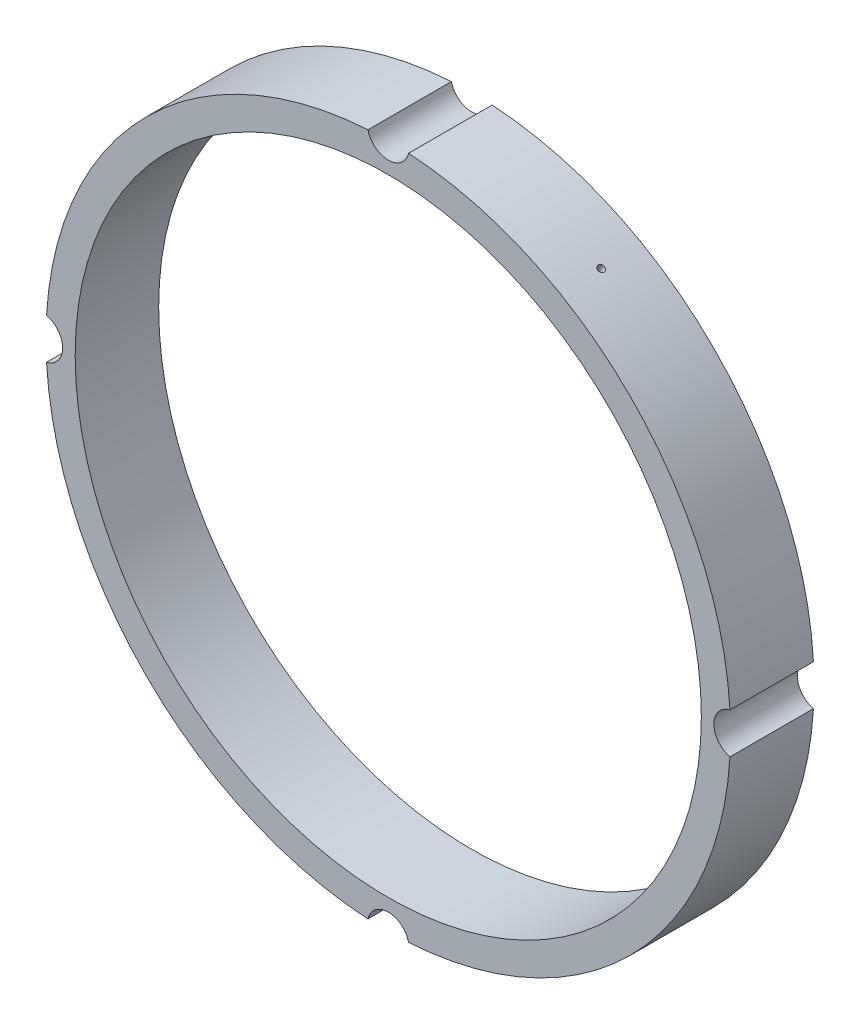
ISO-10303-21;
HEADER;
FILE_DESCRIPTION(('STEP AP214'),'2;1');
FILE_NAME('part.step','',(''),(''),'','','');
FILE_SCHEMA(('AUTOMOTIVE_DESIGN { 1 0 10303 214 1 1 1 1 }'));
ENDSEC;
DATA;
#1=APPLICATION_CONTEXT('core data for automotive mechanical design processes');
#2=APPLICATION_PROTOCOL_DEFINITION('international standard','automotive_design',2000,#1);
#3=PRODUCT_CONTEXT('',#1,'mechanical');
#4=PRODUCT('Part','Part','',(#3));
#5=PRODUCT_RELATED_PRODUCT_CATEGORY('part','',(#4));
#6=PRODUCT_DEFINITION_FORMATION('','',#4);
#7=PRODUCT_DEFINITION_CONTEXT('part definition',#1,'design');
#8=PRODUCT_DEFINITION('design','',#6,#7);
#9=PRODUCT_DEFINITION_SHAPE('','',#8);
#10=(LENGTH_UNIT() NAMED_UNIT(*) SI_UNIT(.MILLI.,.METRE.));
#11=(NAMED_UNIT(*) PLANE_ANGLE_UNIT() SI_UNIT($,.RADIAN.));
#12=(NAMED_UNIT(*) SI_UNIT($,.STERADIAN.) SOLID_ANGLE_UNIT());
#13=UNCERTAINTY_MEASURE_WITH_UNIT(LENGTH_MEASURE(1.E-05),#10,'distance_accuracy_value','');
#14=(GEOMETRIC_REPRESENTATION_CONTEXT(3) GLOBAL_UNCERTAINTY_ASSIGNED_CONTEXT((#13)) GLOBAL_UNIT_ASSIGNED_CONTEXT((#10,
#11,#12)) REPRESENTATION_CONTEXT('',''));
#15=CARTESIAN_POINT('',(0.,0.,0.));
#16=DIRECTION('',(0.,0.,1.));
#17=DIRECTION('',(1.,0.,0.));
#18=AXIS2_PLACEMENT_3D('',#15,#16,#17);
#19=CARTESIAN_POINT('',(0.,0.,20.));
#20=DIRECTION('',(0.,0.,-1.));
#21=DIRECTION('',(-1.,0.,0.));
#22=AXIS2_PLACEMENT_3D('',#19,#20,#21);
#23=CYLINDRICAL_SURFACE('',#22,82.);
#24=CARTESIAN_POINT('',(0.,0.,0.));
#25=DIRECTION('',(0.,0.,1.));
#26=DIRECTION('',(1.,0.,0.));
#27=AXIS2_PLACEMENT_3D('',#24,#25,#26);
#28=CIRCLE('',#27,82.);
#29=CARTESIAN_POINT('',(-4.86723129559619,81.855421686747,0.));
#30=VERTEX_POINT('',#29);
#31=CARTESIAN_POINT('',(-81.8554216867469,4.86723129559705,0.));
#32=VERTEX_POINT('',#31);
#33=EDGE_CURVE('E123',#30,#32,#28,.T.);
#34=ORIENTED_EDGE('',*,*,#33,.T.);
#35=DIRECTION('',(0.,0.,1.));
#36=VECTOR('',#35,1.);
#37=CARTESIAN_POINT('',(-81.8554216867469,4.86723129559704,10.));
#38=LINE('',#37,#36);
#39=CARTESIAN_POINT('',(-81.8554216867469,4.86723129559704,20.));
#40=VERTEX_POINT('',#39);
#41=EDGE_CURVE('E56',#32,#40,#38,.T.);
#42=ORIENTED_EDGE('',*,*,#41,.T.);
#43=CARTESIAN_POINT('',(0.,0.,20.));
#44=DIRECTION('',(0.,0.,1.));
#45=DIRECTION('',(1.,0.,0.));
#46=AXIS2_PLACEMENT_3D('',#43,#44,#45);
#47=CIRCLE('',#46,82.);
#48=CARTESIAN_POINT('',(-4.86723129559619,81.855421686747,20.));
#49=VERTEX_POINT('',#48);
#50=EDGE_CURVE('E130',#49,#40,#47,.T.);
#51=ORIENTED_EDGE('',*,*,#50,.F.);
#52=DIRECTION('',(0.,0.,1.));
#53=VECTOR('',#52,1.);
#54=CARTESIAN_POINT('',(-4.86723129559619,81.855421686747,10.));
#55=LINE('',#54,#53);
#56=EDGE_CURVE('E132',#49,#30,#55,.F.);
#57=ORIENTED_EDGE('',*,*,#56,.T.);
#58=EDGE_LOOP('',(#34,#42,#51,#57));
#59=FACE_BOUND('',#58,.T.);
#60=ADVANCED_FACE('F37',(#59),#23,.T.);
#61=CARTESIAN_POINT('',(-81.8554216867471,-4.86723129559533,20.));
#62=VERTEX_POINT('',#61);
#63=CARTESIAN_POINT('',(-4.86723129559619,-81.855421686747,20.));
#64=VERTEX_POINT('',#63);
#65=EDGE_CURVE('E116',#62,#64,#47,.T.);
#66=ORIENTED_EDGE('',*,*,#65,.F.);
#67=DIRECTION('',(0.,0.,1.));
#68=VECTOR('',#67,1.);
#69=CARTESIAN_POINT('',(-81.8554216867471,-4.86723129559533,10.));
#70=LINE('',#69,#68);
#71=CARTESIAN_POINT('',(-81.8554216867471,-4.86723129559533,0.));
#72=VERTEX_POINT('',#71);
#73=EDGE_CURVE('E107',#62,#72,#70,.F.);
#74=ORIENTED_EDGE('',*,*,#73,.T.);
#75=CARTESIAN_POINT('',(-4.86723129559619,-81.855421686747,0.));
#76=VERTEX_POINT('',#75);
#77=EDGE_CURVE('E64',#72,#76,#28,.T.);
#78=ORIENTED_EDGE('',*,*,#77,.T.);
#79=DIRECTION('',(0.,0.,1.));
#80=VECTOR('',#79,1.);
#81=CARTESIAN_POINT('',(-4.86723129559619,-81.855421686747,10.));
#82=LINE('',#81,#80);
#83=EDGE_CURVE('E161',#76,#64,#82,.T.);
#84=ORIENTED_EDGE('',*,*,#83,.T.);
#85=EDGE_LOOP('',(#66,#74,#78,#84));
#86=FACE_BOUND('',#85,.T.);
#87=ADVANCED_FACE('F115',(#86),#23,.T.);
#88=CARTESIAN_POINT('',(4.86723129559619,-81.855421686747,20.));
#89=VERTEX_POINT('',#88);
#90=CARTESIAN_POINT('',(81.855421686747,-4.86723129559647,20.));
#91=VERTEX_POINT('',#90);
#92=EDGE_CURVE('E146',#89,#91,#47,.T.);
#93=ORIENTED_EDGE('',*,*,#92,.F.);
#94=DIRECTION('',(0.,0.,1.));
#95=VECTOR('',#94,1.);
#96=CARTESIAN_POINT('',(4.86723129559619,-81.855421686747,10.));
#97=LINE('',#96,#95);
#98=CARTESIAN_POINT('',(4.86723129559619,-81.855421686747,0.));
#99=VERTEX_POINT('',#98);
#100=EDGE_CURVE('E214',#89,#99,#97,.F.);
#101=ORIENTED_EDGE('',*,*,#100,.T.);
#102=CARTESIAN_POINT('',(81.855421686747,-4.86723129559647,0.));
#103=VERTEX_POINT('',#102);
#104=EDGE_CURVE('E124',#99,#103,#28,.T.);
#105=ORIENTED_EDGE('',*,*,#104,.T.);
#106=DIRECTION('',(0.,0.,1.));
#107=VECTOR('',#106,1.);
#108=CARTESIAN_POINT('',(81.855421686747,-4.86723129559647,10.));
#109=LINE('',#108,#107);
#110=EDGE_CURVE('E49',#103,#91,#109,.T.);
#111=ORIENTED_EDGE('',*,*,#110,.T.);
#112=EDGE_LOOP('',(#93,#101,#105,#111));
#113=FACE_BOUND('',#112,.T.);
#114=ADVANCED_FACE('F144',(#113),#23,.T.);
#115=CARTESIAN_POINT('',(0.,0.,20.));
#116=DIRECTION('',(0.,0.,1.));
#117=DIRECTION('',(1.,0.,0.));
#118=AXIS2_PLACEMENT_3D('',#115,#116,#117);
#119=PLANE('',#118);
#120=CARTESIAN_POINT('',(-83.,8.6937885337194E-13,20.));
#121=DIRECTION('',(0.,0.,1.));
#122=DIRECTION('',(0.,1.,0.));
#123=AXIS2_PLACEMENT_3D('',#120,#121,#122);
#124=CIRCLE('',#123,5.);
#125=EDGE_CURVE('E112',#62,#40,#124,.T.);
#126=ORIENTED_EDGE('',*,*,#125,.F.);
#127=ORIENTED_EDGE('',*,*,#65,.T.);
#128=CARTESIAN_POINT('',(0.,-83.,20.));
#129=DIRECTION('',(0.,0.,1.));
#130=DIRECTION('',(-1.,0.,0.));
#131=AXIS2_PLACEMENT_3D('',#128,#129,#130);
#132=CIRCLE('',#131,5.);
#133=EDGE_CURVE('E206',#89,#64,#132,.T.);
#134=ORIENTED_EDGE('',*,*,#133,.F.);
#135=ORIENTED_EDGE('',*,*,#92,.T.);
#136=CARTESIAN_POINT('',(83.,-2.8979295112398E-13,20.));
#137=DIRECTION('',(0.,0.,1.));
#138=DIRECTION('',(0.,-1.,0.));
#139=AXIS2_PLACEMENT_3D('',#136,#137,#138);
#140=CIRCLE('',#139,5.);
#141=CARTESIAN_POINT('',(81.855421686747,4.8672312955959,20.));
#142=VERTEX_POINT('',#141);
#143=EDGE_CURVE('E153',#142,#91,#140,.T.);
#144=ORIENTED_EDGE('',*,*,#143,.F.);
#145=CARTESIAN_POINT('',(4.86723129559619,81.855421686747,20.));
#146=VERTEX_POINT('',#145);
#147=EDGE_CURVE('E126',#142,#146,#47,.T.);
#148=ORIENTED_EDGE('',*,*,#147,.T.);
#149=CARTESIAN_POINT('',(0.,83.,20.));
#150=DIRECTION('',(0.,0.,1.));
#151=DIRECTION('',(1.,0.,0.));
#152=AXIS2_PLACEMENT_3D('',#149,#150,#151);
#153=CIRCLE('',#152,5.);
#154=EDGE_CURVE('E156',#49,#146,#153,.T.);
#155=ORIENTED_EDGE('',*,*,#154,.F.);
#156=ORIENTED_EDGE('',*,*,#50,.T.);
#157=EDGE_LOOP('',(#126,#127,#134,#135,#144,#148,#155,#156));
#158=FACE_BOUND('',#157,.T.);
#159=CARTESIAN_POINT('',(0.,0.,20.));
#160=DIRECTION('',(0.,0.,1.));
#161=DIRECTION('',(1.,0.,0.));
#162=AXIS2_PLACEMENT_3D('',#159,#160,#161);
#163=CIRCLE('',#162,75.);
#164=CARTESIAN_POINT('',(75.,0.,20.));
#165=VERTEX_POINT('',#164);
#166=EDGE_CURVE('E168',#165,#165,#163,.T.);
#167=ORIENTED_EDGE('',*,*,#166,.F.);
#168=EDGE_LOOP('',(#167));
#169=FACE_BOUND('',#168,.T.);
#170=ADVANCED_FACE('F202',(#158,#169),#119,.T.);
#171=CARTESIAN_POINT('',(0.,0.,0.));
#172=DIRECTION('',(0.,0.,1.));
#173=DIRECTION('',(1.,0.,0.));
#174=AXIS2_PLACEMENT_3D('',#171,#172,#173);
#175=PLANE('',#174);
#176=ORIENTED_EDGE('',*,*,#77,.F.);
#177=CARTESIAN_POINT('',(-83.,8.6937885337194E-13,0.));
#178=DIRECTION('',(0.,0.,1.));
#179=DIRECTION('',(0.,1.,0.));
#180=AXIS2_PLACEMENT_3D('',#177,#178,#179);
#181=CIRCLE('',#180,5.);
#182=EDGE_CURVE('E105',#72,#32,#181,.T.);
#183=ORIENTED_EDGE('',*,*,#182,.T.);
#184=ORIENTED_EDGE('',*,*,#33,.F.);
#185=CARTESIAN_POINT('',(0.,83.,0.));
#186=DIRECTION('',(0.,0.,1.));
#187=DIRECTION('',(1.,0.,0.));
#188=AXIS2_PLACEMENT_3D('',#185,#186,#187);
#189=CIRCLE('',#188,5.);
#190=CARTESIAN_POINT('',(4.86723129559619,81.855421686747,0.));
#191=VERTEX_POINT('',#190);
#192=EDGE_CURVE('E159',#30,#191,#189,.T.);
#193=ORIENTED_EDGE('',*,*,#192,.T.);
#194=CARTESIAN_POINT('',(81.855421686747,4.8672312955959,0.));
#195=VERTEX_POINT('',#194);
#196=EDGE_CURVE('E127',#195,#191,#28,.T.);
#197=ORIENTED_EDGE('',*,*,#196,.F.);
#198=CARTESIAN_POINT('',(83.,-2.8979295112398E-13,0.));
#199=DIRECTION('',(0.,0.,1.));
#200=DIRECTION('',(0.,-1.,0.));
#201=AXIS2_PLACEMENT_3D('',#198,#199,#200);
#202=CIRCLE('',#201,5.);
#203=EDGE_CURVE('E151',#195,#103,#202,.T.);
#204=ORIENTED_EDGE('',*,*,#203,.T.);
#205=ORIENTED_EDGE('',*,*,#104,.F.);
#206=CARTESIAN_POINT('',(0.,-83.,0.));
#207=DIRECTION('',(0.,0.,1.));
#208=DIRECTION('',(-1.,0.,0.));
#209=AXIS2_PLACEMENT_3D('',#206,#207,#208);
#210=CIRCLE('',#209,5.);
#211=EDGE_CURVE('E122',#99,#76,#210,.T.);
#212=ORIENTED_EDGE('',*,*,#211,.T.);
#213=EDGE_LOOP('',(#176,#183,#184,#193,#197,#204,#205,#212));
#214=FACE_BOUND('',#213,.T.);
#215=CARTESIAN_POINT('',(0.,0.,0.));
#216=DIRECTION('',(0.,0.,1.));
#217=DIRECTION('',(1.,0.,0.));
#218=AXIS2_PLACEMENT_3D('',#215,#216,#217);
#219=CIRCLE('',#218,75.);
#220=CARTESIAN_POINT('',(75.,0.,0.));
#221=VERTEX_POINT('',#220);
#222=EDGE_CURVE('E166',#221,#221,#219,.T.);
#223=ORIENTED_EDGE('',*,*,#222,.T.);
#224=EDGE_LOOP('',(#223));
#225=FACE_BOUND('',#224,.T.);
#226=ADVANCED_FACE('F119',(#214,#225),#175,.F.);
#227=CARTESIAN_POINT('',(40.3052284110281,71.4107034185693,10.));
#228=CARTESIAN_POINT('',(40.305230162785,71.4107024681233,9.95506479609301));
#229=CARTESIAN_POINT('',(40.3085368078791,71.40883642493,9.91009703714874));
#230=CARTESIAN_POINT('',(40.3216802135916,71.4014156688339,9.82140003350558));
#231=CARTESIAN_POINT('',(40.3315248278901,71.3958565196163,9.7776723443821));
#232=CARTESIAN_POINT('',(40.3574592527584,71.3811999286591,9.69275330768963));
#233=CARTESIAN_POINT('',(40.3735460727166,71.3721041812829,9.65156075648079));
#234=CARTESIAN_POINT('',(40.4114971299767,71.3506227921757,9.57287429083479));
#235=CARTESIAN_POINT('',(40.4333599334488,71.3382379669211,9.53537946164327));
#236=CARTESIAN_POINT('',(40.4822388609424,71.3105120161913,9.4651344354136));
#237=CARTESIAN_POINT('',(40.5092556770344,71.2951704936937,9.43238487660122));
#238=CARTESIAN_POINT('',(40.5676657214676,71.2619507473826,9.37256517048709));
#239=CARTESIAN_POINT('',(40.59905912185,71.2440724238483,9.34549524655357));
#240=CARTESIAN_POINT('',(40.6653214679689,71.2062713712898,9.29780471692709));
#241=CARTESIAN_POINT('',(40.7001904182244,71.1863486396075,9.27718411961991));
#242=CARTESIAN_POINT('',(40.772406334745,71.1450111456782,9.24297779787522));
#243=CARTESIAN_POINT('',(40.8097532955037,71.1235963867468,9.22939205780614));
#244=CARTESIAN_POINT('',(40.8858585322044,71.0798740635081,9.20964144378451));
#245=CARTESIAN_POINT('',(40.9246167652487,71.0575665263361,9.20347634446412));
#246=CARTESIAN_POINT('',(41.0024427076472,71.0126869615936,9.19874133559804));
#247=CARTESIAN_POINT('',(41.0415104163721,70.9901149345609,9.20017141060814));
#248=CARTESIAN_POINT('',(41.1188455717403,70.945348935138,9.21058592631372));
#249=CARTESIAN_POINT('',(41.1571130452983,70.9231549500377,9.21957011251892));
#250=CARTESIAN_POINT('',(41.2317665366884,70.8797805669154,9.2448374350582));
#251=CARTESIAN_POINT('',(41.2681525523058,70.8586001700864,9.26112057998317));
#252=CARTESIAN_POINT('',(41.3380172194721,70.8178647619419,9.30052388209611));
#253=CARTESIAN_POINT('',(41.3714958216182,70.7983097782456,9.32364415543102));
#254=CARTESIAN_POINT('',(41.434603016724,70.7613949232539,9.37606530348475));
#255=CARTESIAN_POINT('',(41.4642316101463,70.7440350516948,9.40536617746084));
#256=CARTESIAN_POINT('',(41.5188083007378,70.7120185025764,9.4693182281911));
#257=CARTESIAN_POINT('',(41.5437562021976,70.6973619380483,9.50396962855131));
#258=CARTESIAN_POINT('',(41.5882710512857,70.6711849340483,9.57763829735254));
#259=CARTESIAN_POINT('',(41.6078379981956,70.6596644949952,9.61665556637643));
#260=CARTESIAN_POINT('',(41.641043626485,70.640100926749,9.69794850712354));
#261=CARTESIAN_POINT('',(41.6546823022913,70.6320578008251,9.74022418191002));
#262=CARTESIAN_POINT('',(41.6756502729947,70.6196879331484,9.8268337992777));
#263=CARTESIAN_POINT('',(41.6829795699621,70.6153611901761,9.87116774118354));
#264=CARTESIAN_POINT('',(41.6911239668386,70.6105530728755,9.96063342804992));
#265=CARTESIAN_POINT('',(41.6919393353669,70.6100715399797,10.0057651400354));
#266=CARTESIAN_POINT('',(41.6870338226723,70.6129677812092,10.0955469355632));
#267=CARTESIAN_POINT('',(41.6813129419862,70.6163455550177,10.1401970191451));
#268=CARTESIAN_POINT('',(41.6634948178797,70.6268596602105,10.2277472089013));
#269=CARTESIAN_POINT('',(41.6513976958952,70.6339959200141,10.2706473483867));
#270=CARTESIAN_POINT('',(41.6211650638207,70.6518147314161,10.3534808607507));
#271=CARTESIAN_POINT('',(41.6030295531477,70.6624972833568,10.3934142333428));
#272=CARTESIAN_POINT('',(41.5612265203059,70.6870924286367,10.469182062557));
#273=CARTESIAN_POINT('',(41.537558817141,70.7010051276562,10.5050163850138));
#274=CARTESIAN_POINT('',(41.4853544455829,70.7316497769729,10.5715675519885));
#275=CARTESIAN_POINT('',(41.4568177741148,70.7483817290505,10.6022843932747));
#276=CARTESIAN_POINT('',(41.3956750206665,70.7841743762166,10.6577296689302));
#277=CARTESIAN_POINT('',(41.3630688010143,70.8032351500882,10.6824579006228));
#278=CARTESIAN_POINT('',(41.2947046718655,70.8431290267123,10.7252225914411));
#279=CARTESIAN_POINT('',(41.2589467660966,70.8639621273686,10.7432590584816));
#280=CARTESIAN_POINT('',(41.1852880913143,70.9067969831621,10.7721278944135));
#281=CARTESIAN_POINT('',(41.1473873619883,70.9287987166545,10.7829603966825));
#282=CARTESIAN_POINT('',(41.0705139344065,70.9733390629306,10.7971142516783));
#283=CARTESIAN_POINT('',(41.0315412345227,70.9958776765296,10.8004355929962));
#284=CARTESIAN_POINT('',(40.9536306752187,71.0408485140235,10.799472796462));
#285=CARTESIAN_POINT('',(40.9146928143604,71.0632807424909,10.7951889885238));
#286=CARTESIAN_POINT('',(40.8379572703114,71.1074061241529,10.779138152379));
#287=CARTESIAN_POINT('',(40.8001595894107,71.129099275863,10.7673711091438));
#288=CARTESIAN_POINT('',(40.7267814451327,71.1711392536284,10.7366876325079));
#289=CARTESIAN_POINT('',(40.6912010228659,71.1914860547211,10.7177710665927));
#290=CARTESIAN_POINT('',(40.6232765406942,71.2302669838026,10.6733263545455));
#291=CARTESIAN_POINT('',(40.5909323548439,71.2487011862253,10.6477984658466));
#292=CARTESIAN_POINT('',(40.5304074104666,71.2831487094411,10.5908575506649));
#293=CARTESIAN_POINT('',(40.5022263893502,71.2991621829217,10.5594448956443));
#294=CARTESIAN_POINT('',(40.4508278504761,71.328335198352,10.4916147700884));
#295=CARTESIAN_POINT('',(40.4276115676375,71.3414940302556,10.4551960580487));
#296=CARTESIAN_POINT('',(40.3868099222115,71.3646000206399,10.3783804479163));
#297=CARTESIAN_POINT('',(40.3692273551643,71.3745455846659,10.3379815877697));
#298=CARTESIAN_POINT('',(40.340231691055,71.3909377104108,10.254397470705));
#299=CARTESIAN_POINT('',(40.3288112020707,71.3973884644812,10.2112156221679));
#300=CARTESIAN_POINT('',(40.3155112248783,71.4048988976244,10.1397990232466));
#301=CARTESIAN_POINT('',(40.3116600520628,71.4070729879977,10.1120282708236));
#302=CARTESIAN_POINT('',(40.3065180975612,71.4099755455663,10.0561759208297));
#303=CARTESIAN_POINT('',(40.3052273157971,71.4107040128057,10.0280943232683));
#304=CARTESIAN_POINT('',(40.3052284110281,71.4107034185693,10.));
#305=B_SPLINE_CURVE_WITH_KNOTS('',3,(#227,#228,#229,#230,#231,#232,#233,#234,#235,#236,#237,
#238,#239,#240,#241,#242,#243,#244,#245,#246,#247,#248,#249,#250,#251,#252,#253,#254,#255,#256,
#257,#258,#259,#260,#261,#262,#263,#264,#265,#266,#267,#268,#269,#270,#271,#272,#273,#274,#275,
#276,#277,#278,#279,#280,#281,#282,#283,#284,#285,#286,#287,#288,#289,#290,#291,#292,#293,#294,
#295,#296,#297,#298,#299,#300,#301,#302,#303,#304),.UNSPECIFIED.,.T.,.F.,(4,2,2,2,2,2,2,2,2,2,2,
2,2,2,2,2,2,2,2,2,2,2,2,2,2,2,2,2,2,2,2,2,2,2,2,2,2,2,4),(0.,0.134703067123949,
0.269568238553243,0.404368876326958,0.539136082591844,0.673921397882173,0.808712013005295,
0.94350280339,1.07829329426615,1.21307969139774,1.3478658144514,1.4826473968801,
1.61742913794746,1.75221316877516,1.88699718340582,2.02178683237555,2.15657649934034,
2.29136629302324,2.426156042478,2.56094023348925,2.69572441343266,2.83050602649563,
2.9652876525739,3.10007368890393,3.23485981034963,3.36965049281604,3.50444101585779,
3.63922904325401,3.77401727538222,3.90879966049609,4.04358231629638,4.17836747038269,
4.31314737696436,4.44791877874285,4.58272366439784,4.71759533917825,4.85230486249334,
4.93652372208243,5.02074257910246),.UNSPECIFIED.);
#306=CARTESIAN_POINT('',(40.3052284110281,71.4107034185693,10.));
#307=VERTEX_POINT('',#306);
#308=EDGE_CURVE('E11',#307,#307,#305,.T.);
#309=ORIENTED_EDGE('',*,*,#308,.T.);
#310=EDGE_LOOP('',(#309));
#311=FACE_BOUND('',#310,.T.);
#312=ORIENTED_EDGE('',*,*,#147,.F.);
#313=DIRECTION('',(0.,0.,1.));
#314=VECTOR('',#313,1.);
#315=CARTESIAN_POINT('',(81.855421686747,4.8672312955959,10.));
#316=LINE('',#315,#314);
#317=EDGE_CURVE('E138',#142,#195,#316,.F.);
#318=ORIENTED_EDGE('',*,*,#317,.T.);
#319=ORIENTED_EDGE('',*,*,#196,.T.);
#320=DIRECTION('',(0.,0.,1.));
#321=VECTOR('',#320,1.);
#322=CARTESIAN_POINT('',(4.86723129559619,81.855421686747,10.));
#323=LINE('',#322,#321);
#324=EDGE_CURVE('E135',#191,#146,#323,.T.);
#325=ORIENTED_EDGE('',*,*,#324,.T.);
#326=EDGE_LOOP('',(#312,#318,#319,#325));
#327=FACE_BOUND('',#326,.T.);
#328=ADVANCED_FACE('F39',(#311,#327),#23,.T.);
#329=CARTESIAN_POINT('',(0.,0.,20.));
#330=DIRECTION('',(0.,0.,-1.));
#331=DIRECTION('',(-1.,0.,0.));
#332=AXIS2_PLACEMENT_3D('',#329,#330,#331);
#333=CYLINDRICAL_SURFACE('',#332,75.);
#334=CARTESIAN_POINT('',(36.8050462829542,65.3482101370007,10.));
#335=CARTESIAN_POINT('',(36.8050480371068,65.3482091908556,9.9550650202504));
#336=CARTESIAN_POINT('',(36.8083563893281,65.3463461799556,9.91009749094247));
#337=CARTESIAN_POINT('',(36.8215064307599,65.3389372344705,9.82140095562176));
#338=CARTESIAN_POINT('',(36.8313559762903,65.3333868711768,9.77767350494019));
#339=CARTESIAN_POINT('',(36.8573029001601,65.3187526175866,9.69275494634586));
#340=CARTESIAN_POINT('',(36.8733972851322,65.3096704202157,9.65156263419737));
#341=CARTESIAN_POINT('',(36.9113652327449,65.2882193796654,9.57287659923403));
#342=CARTESIAN_POINT('',(36.9332373616623,65.275851351847,9.535381962022));
#343=CARTESIAN_POINT('',(36.9821357786632,65.2481602840425,9.46513702906338));
#344=CARTESIAN_POINT('',(37.0091627888349,65.2328368300614,9.43238739912278));
#345=CARTESIAN_POINT('',(37.0675928290538,65.1996525164563,9.37256749931847));
#346=CARTESIAN_POINT('',(37.0989960311762,65.1817915570551,9.34549745288538));
#347=CARTESIAN_POINT('',(37.165276621277,65.1440224914367,9.29780653018475));
#348=CARTESIAN_POINT('',(37.2001540272983,65.1241143745878,9.27718568741294));
#349=CARTESIAN_POINT('',(37.2723844475244,65.0828017747338,9.24297889347224));
#350=CARTESIAN_POINT('',(37.309737456126,65.0613972951156,9.22939292638149));
#351=CARTESIAN_POINT('',(37.3858514560471,65.0176901750221,9.20964196631049));
#352=CARTESIAN_POINT('',(37.4246123956757,64.9953875675174,9.20347670116969));
#353=CARTESIAN_POINT('',(37.5024403148383,64.9505118372576,9.19874132894007));
#354=CARTESIAN_POINT('',(37.541507293736,64.9279387150649,9.20017120606366));
#355=CARTESIAN_POINT('',(37.6188373554944,64.8831647861721,9.21058526118988));
#356=CARTESIAN_POINT('',(37.6571004707224,64.8609639644887,9.21956913443268));
#357=CARTESIAN_POINT('',(37.7317423544195,64.8175707954564,9.24483569725782));
#358=CARTESIAN_POINT('',(37.7681211206258,64.7963784493184,9.26111839560382));
#359=CARTESIAN_POINT('',(37.8379693340923,64.7556153066755,9.30052074156641));
#360=CARTESIAN_POINT('',(37.8714387220741,64.7360445432105,9.32364052844562));
#361=CARTESIAN_POINT('',(37.934526459754,64.6990961367939,9.37606063773741));
#362=CARTESIAN_POINT('',(37.9641448097006,64.6817184937006,9.40536095975093));
#363=CARTESIAN_POINT('',(38.0187013917973,64.6496662631315,9.46931214094039));
#364=CARTESIAN_POINT('',(38.0436393901331,64.6349918106984,9.50396326726653));
#365=CARTESIAN_POINT('',(38.0881356631969,64.6087810653332,9.57763147675294));
#366=CARTESIAN_POINT('',(38.1076939372037,64.597244772822,9.61664856049857));
#367=CARTESIAN_POINT('',(38.1408844541449,64.5776533045459,9.69794124937334));
#368=CARTESIAN_POINT('',(38.1545166903565,64.5695981327303,9.74021685819908));
#369=CARTESIAN_POINT('',(38.1754747513236,64.5572093338679,9.82682645392058));
#370=CARTESIAN_POINT('',(38.1828005784973,64.5528757053942,9.87116044002704));
#371=CARTESIAN_POINT('',(38.1909413824111,64.5480597632868,9.96062594210085));
#372=CARTESIAN_POINT('',(38.1917566800836,64.5475772598144,10.0057574186465));
#373=CARTESIAN_POINT('',(38.1868545475179,64.5504775161813,10.0955388134101));
#374=CARTESIAN_POINT('',(38.1811371179785,64.5538602756073,10.1401887316796));
#375=CARTESIAN_POINT('',(38.1633291083601,64.5643896994272,10.2277384966913));
#376=CARTESIAN_POINT('',(38.1512386734367,64.5715362780939,10.2706383832693));
#377=CARTESIAN_POINT('',(38.121021943817,64.58937987047,10.3534715036639));
#378=CARTESIAN_POINT('',(38.1028956482698,64.6000768846797,10.3934047370624));
#379=CARTESIAN_POINT('',(38.0611124544012,64.6247035165116,10.4691726870877));
#380=CARTESIAN_POINT('',(38.0374553396379,64.6386332606425,10.5050072432363));
#381=CARTESIAN_POINT('',(37.9852724588776,64.6693125821188,10.5715590062329));
#382=CARTESIAN_POINT('',(37.9567466895903,64.6860621613697,10.6022762096227));
#383=CARTESIAN_POINT('',(37.8956246465006,64.7218887639564,10.6577225312695));
#384=CARTESIAN_POINT('',(37.863028208343,64.7409658812668,10.6824514076266));
#385=CARTESIAN_POINT('',(37.7946816007971,64.7808892105927,10.7252174240146));
#386=CARTESIAN_POINT('',(37.7589314352171,64.8017354204719,10.7432545721263));
#387=CARTESIAN_POINT('',(37.6852854659991,64.8445917012878,10.7721247176784));
#388=CARTESIAN_POINT('',(37.6473897097049,64.8666017465431,10.7829578740123));
#389=CARTESIAN_POINT('',(37.570522798859,64.9111530416104,10.7971130496145));
#390=CARTESIAN_POINT('',(37.5315516427333,64.9336942922,10.8004350578895));
#391=CARTESIAN_POINT('',(37.4536409057876,64.9786642363913,10.7994735869246));
#392=CARTESIAN_POINT('',(37.4147013234452,65.0010929357281,10.7951904992234));
#393=CARTESIAN_POINT('',(37.3379589704716,65.0452056620496,10.7791412017963));
#394=CARTESIAN_POINT('',(37.3001562021231,65.0668896875391,10.7673749770457));
#395=CARTESIAN_POINT('',(37.2267650922114,65.1089068431069,10.7366932260097));
#396=CARTESIAN_POINT('',(37.1911767916611,65.1292399481661,10.7177775673592));
#397=CARTESIAN_POINT('',(37.1232346218809,65.1679904761977,10.6733347372847));
#398=CARTESIAN_POINT('',(37.0908806269882,65.1864079735984,10.6478078228667));
#399=CARTESIAN_POINT('',(37.0303349483126,65.2208211267837,10.5908686503106));
#400=CARTESIAN_POINT('',(37.0021430357465,65.236816915687,10.5594567158782));
#401=CARTESIAN_POINT('',(36.9507230753817,65.2659554454819,10.491627923468));
#402=CARTESIAN_POINT('',(36.9274962624952,65.2790974766038,10.4552098240561));
#403=CARTESIAN_POINT('',(36.886674973326,65.3021727146869,10.3783951511133));
#404=CARTESIAN_POINT('',(36.8690833131314,65.3121043173042,10.3379966015531));
#405=CARTESIAN_POINT('',(36.8400719807352,65.3284729390554,10.2544129046929));
#406=CARTESIAN_POINT('',(36.8286449144051,65.3349141447912,10.211231165635));
#407=CARTESIAN_POINT('',(36.8153363830033,65.3424137824977,10.1398121093518));
#408=CARTESIAN_POINT('',(36.8114824882576,65.3445848245014,10.1120387960276));
#409=CARTESIAN_POINT('',(36.8063368898609,65.3474832975298,10.0561812304938));
#410=CARTESIAN_POINT('',(36.8050451861163,65.3482107286071,10.0280969782954));
#411=CARTESIAN_POINT('',(36.8050462829542,65.3482101370007,10.));
#412=B_SPLINE_CURVE_WITH_KNOTS('',3,(#334,#335,#336,#337,#338,#339,#340,#341,#342,#343,#344,
#345,#346,#347,#348,#349,#350,#351,#352,#353,#354,#355,#356,#357,#358,#359,#360,#361,#362,#363,
#364,#365,#366,#367,#368,#369,#370,#371,#372,#373,#374,#375,#376,#377,#378,#379,#380,#381,#382,
#383,#384,#385,#386,#387,#388,#389,#390,#391,#392,#393,#394,#395,#396,#397,#398,#399,#400,#401,
#402,#403,#404,#405,#406,#407,#408,#409,#410,#411),.UNSPECIFIED.,.T.,.F.,(4,2,2,2,2,2,2,2,2,2,2,
2,2,2,2,2,2,2,2,2,2,2,2,2,2,2,2,2,2,2,2,2,2,2,2,2,2,2,4),(0.,0.134702384884244,
0.269566847771312,0.40436674516063,0.539133223883879,0.673918594382309,0.808709266243901,
0.943500638166865,1.07829170501872,1.21307782814302,1.34786367109516,1.48264407648282,
1.61742464370115,1.7522079564138,1.88699126042393,2.02178129595247,2.15657134955318,
2.29136155606753,2.42615171089689,2.56093522128892,2.69571871726381,2.83049914345483,
2.96527958864289,3.10006530918112,3.2348511208066,3.36964237622914,3.50443346888079,
3.63922158843893,3.7740099052748,3.9087912829084,4.04357293115624,4.17835707488293,
4.31313597979599,4.44790747336683,4.58271244820657,4.71758468521552,4.8522947878496,
4.93652160053771,5.02074841015293),.UNSPECIFIED.);
#413=CARTESIAN_POINT('',(36.8050462829542,65.3482101370007,10.));
#414=VERTEX_POINT('',#413);
#415=EDGE_CURVE('E207',#414,#414,#412,.T.);
#416=ORIENTED_EDGE('',*,*,#415,.F.);
#417=EDGE_LOOP('',(#416));
#418=FACE_BOUND('',#417,.T.);
#419=ORIENTED_EDGE('',*,*,#166,.T.);
#420=EDGE_LOOP('',(#419));
#421=FACE_BOUND('',#420,.T.);
#422=ORIENTED_EDGE('',*,*,#222,.F.);
#423=EDGE_LOOP('',(#422));
#424=FACE_BOUND('',#423,.T.);
#425=ADVANCED_FACE('F173',(#418,#421,#424),#333,.F.);
#426=CARTESIAN_POINT('',(0.,83.,0.));
#427=DIRECTION('',(0.,0.,1.));
#428=DIRECTION('',(1.,0.,0.));
#429=AXIS2_PLACEMENT_3D('',#426,#427,#428);
#430=CYLINDRICAL_SURFACE('',#429,5.);
#431=ORIENTED_EDGE('',*,*,#192,.F.);
#432=ORIENTED_EDGE('',*,*,#56,.F.);
#433=ORIENTED_EDGE('',*,*,#154,.T.);
#434=ORIENTED_EDGE('',*,*,#324,.F.);
#435=EDGE_LOOP('',(#431,#432,#433,#434));
#436=FACE_BOUND('',#435,.T.);
#437=ADVANCED_FACE('F175',(#436),#430,.F.);
#438=CARTESIAN_POINT('',(83.,-2.8979295112398E-13,0.));
#439=DIRECTION('',(0.,0.,1.));
#440=DIRECTION('',(1.,0.,0.));
#441=AXIS2_PLACEMENT_3D('',#438,#439,#440);
#442=CYLINDRICAL_SURFACE('',#441,5.);
#443=ORIENTED_EDGE('',*,*,#203,.F.);
#444=ORIENTED_EDGE('',*,*,#317,.F.);
#445=ORIENTED_EDGE('',*,*,#143,.T.);
#446=ORIENTED_EDGE('',*,*,#110,.F.);
#447=EDGE_LOOP('',(#443,#444,#445,#446));
#448=FACE_BOUND('',#447,.T.);
#449=ADVANCED_FACE('F150',(#448),#442,.F.);
#450=CARTESIAN_POINT('',(0.,-83.,0.));
#451=DIRECTION('',(0.,0.,1.));
#452=DIRECTION('',(1.,0.,0.));
#453=AXIS2_PLACEMENT_3D('',#450,#451,#452);
#454=CYLINDRICAL_SURFACE('',#453,5.);
#455=ORIENTED_EDGE('',*,*,#211,.F.);
#456=ORIENTED_EDGE('',*,*,#100,.F.);
#457=ORIENTED_EDGE('',*,*,#133,.T.);
#458=ORIENTED_EDGE('',*,*,#83,.F.);
#459=EDGE_LOOP('',(#455,#456,#457,#458));
#460=FACE_BOUND('',#459,.T.);
#461=ADVANCED_FACE('F216',(#460),#454,.F.);
#462=CARTESIAN_POINT('',(-83.,8.6937885337194E-13,0.));
#463=DIRECTION('',(0.,0.,1.));
#464=DIRECTION('',(1.,0.,0.));
#465=AXIS2_PLACEMENT_3D('',#462,#463,#464);
#466=CYLINDRICAL_SURFACE('',#465,5.);
#467=ORIENTED_EDGE('',*,*,#182,.F.);
#468=ORIENTED_EDGE('',*,*,#73,.F.);
#469=ORIENTED_EDGE('',*,*,#125,.T.);
#470=ORIENTED_EDGE('',*,*,#41,.F.);
#471=EDGE_LOOP('',(#467,#468,#469,#470));
#472=FACE_BOUND('',#471,.T.);
#473=ADVANCED_FACE('F106',(#472),#466,.F.);
#474=CARTESIAN_POINT('',(41.,71.014083110324,10.));
#475=DIRECTION('',(0.5,0.866025403784439,0.));
#476=DIRECTION('',(-0.866025403784439,0.5,0.));
#477=AXIS2_PLACEMENT_3D('',#474,#475,#476);
#478=CYLINDRICAL_SURFACE('',#477,0.799999999999989);
#479=ORIENTED_EDGE('',*,*,#415,.T.);
#480=EDGE_LOOP('',(#479));
#481=FACE_BOUND('',#480,.T.);
#482=ORIENTED_EDGE('',*,*,#308,.F.);
#483=EDGE_LOOP('',(#482));
#484=FACE_BOUND('',#483,.T.);
#485=ADVANCED_FACE('F223',(#481,#484),#478,.F.);
#486=CLOSED_SHELL('',(#60,#87,#114,#170,#226,#328,#425,#437,#449,#461,#473,#485));
#487=MANIFOLD_SOLID_BREP('B2',#486);
#488=ADVANCED_BREP_SHAPE_REPRESENTATION('',(#18,#487),#14);
#489=SHAPE_DEFINITION_REPRESENTATION(#9,#488);
ENDSEC;
END-ISO-10303-21;
